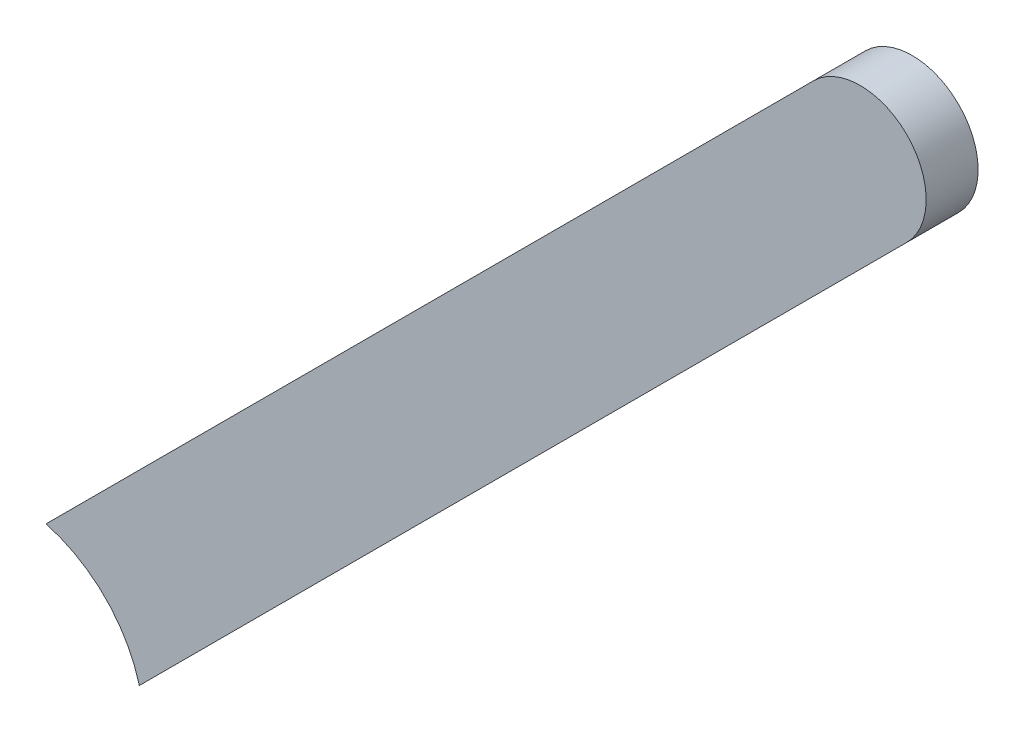
ISO-10303-21;
HEADER;
FILE_DESCRIPTION(('STEP AP214'),'2;1');
FILE_NAME('part.step','',(''),(''),'','','');
FILE_SCHEMA(('AUTOMOTIVE_DESIGN { 1 0 10303 214 1 1 1 1 }'));
ENDSEC;
DATA;
#1=APPLICATION_CONTEXT('core data for automotive mechanical design processes');
#2=APPLICATION_PROTOCOL_DEFINITION('international standard','automotive_design',2000,#1);
#3=PRODUCT_CONTEXT('',#1,'mechanical');
#4=PRODUCT('Part','Part','',(#3));
#5=PRODUCT_RELATED_PRODUCT_CATEGORY('part','',(#4));
#6=PRODUCT_DEFINITION_FORMATION('','',#4);
#7=PRODUCT_DEFINITION_CONTEXT('part definition',#1,'design');
#8=PRODUCT_DEFINITION('design','',#6,#7);
#9=PRODUCT_DEFINITION_SHAPE('','',#8);
#10=(LENGTH_UNIT() NAMED_UNIT(*) SI_UNIT(.MILLI.,.METRE.));
#11=(NAMED_UNIT(*) PLANE_ANGLE_UNIT() SI_UNIT($,.RADIAN.));
#12=(NAMED_UNIT(*) SI_UNIT($,.STERADIAN.) SOLID_ANGLE_UNIT());
#13=UNCERTAINTY_MEASURE_WITH_UNIT(LENGTH_MEASURE(1.E-05),#10,'distance_accuracy_value','');
#14=(GEOMETRIC_REPRESENTATION_CONTEXT(3) GLOBAL_UNCERTAINTY_ASSIGNED_CONTEXT((#13)) GLOBAL_UNIT_ASSIGNED_CONTEXT((#10,
#11,#12)) REPRESENTATION_CONTEXT('',''));
#15=CARTESIAN_POINT('',(0.,0.,0.));
#16=DIRECTION('',(0.,0.,1.));
#17=DIRECTION('',(1.,0.,0.));
#18=AXIS2_PLACEMENT_3D('',#15,#16,#17);
#19=CARTESIAN_POINT('',(141.206690128539,55.2860059885386,0.));
#20=DIRECTION('',(-0.707106781186547,0.707106781186548,0.));
#21=DIRECTION('',(0.707106781186548,0.707106781186547,0.));
#22=AXIS2_PLACEMENT_3D('',#19,#20,#21);
#23=PLANE('',#22);
#24=DIRECTION('',(0.707106781186548,0.707106781186547,0.));
#25=VECTOR('',#24,1.);
#26=CARTESIAN_POINT('',(140.8956034,54.97491926,0.1999996));
#27=LINE('',#26,#25);
#28=CARTESIAN_POINT('',(141.206690128539,55.2860059885386,0.1999996));
#29=VERTEX_POINT('',#28);
#30=CARTESIAN_POINT('',(144.16108074,58.2403966,0.1999996));
#31=VERTEX_POINT('',#30);
#32=EDGE_CURVE('E11',#29,#31,#27,.T.);
#33=ORIENTED_EDGE('',*,*,#32,.F.);
#34=DIRECTION('',(0.,0.,1.));
#35=VECTOR('',#34,1.);
#36=CARTESIAN_POINT('',(141.206690128539,55.2860059885386,0.));
#37=LINE('',#36,#35);
#38=CARTESIAN_POINT('',(141.206690128539,55.2860059885386,0.));
#39=VERTEX_POINT('',#38);
#40=EDGE_CURVE('E24',#39,#29,#37,.T.);
#41=ORIENTED_EDGE('',*,*,#40,.F.);
#42=DIRECTION('',(0.707106781186548,0.707106781186547,0.));
#43=VECTOR('',#42,1.);
#44=CARTESIAN_POINT('',(140.8956034,54.97491926,0.));
#45=LINE('',#44,#43);
#46=CARTESIAN_POINT('',(144.16108074,58.2403966,0.));
#47=VERTEX_POINT('',#46);
#48=EDGE_CURVE('E75',#39,#47,#45,.T.);
#49=ORIENTED_EDGE('',*,*,#48,.T.);
#50=DIRECTION('',(0.,0.,1.));
#51=VECTOR('',#50,1.);
#52=CARTESIAN_POINT('',(144.16108074,58.2403966,0.));
#53=LINE('',#52,#51);
#54=EDGE_CURVE('E37',#47,#31,#53,.T.);
#55=ORIENTED_EDGE('',*,*,#54,.T.);
#56=EDGE_LOOP('',(#33,#41,#49,#55));
#57=FACE_BOUND('',#56,.T.);
#58=ADVANCED_FACE('F17',(#57),#23,.F.);
#59=CARTESIAN_POINT('',(143.98147607,58.42000127,0.));
#60=DIRECTION('',(0.,0.,-1.));
#61=DIRECTION('',(0.707106781186618,-0.707106781186478,0.));
#62=AXIS2_PLACEMENT_3D('',#59,#60,#61);
#63=CYLINDRICAL_SURFACE('',#62,0.253999360179561);
#64=CARTESIAN_POINT('',(143.98147607,58.42000127,0.1999996));
#65=DIRECTION('',(0.,0.,1.));
#66=DIRECTION('',(0.707106781186618,-0.707106781186478,0.));
#67=AXIS2_PLACEMENT_3D('',#64,#65,#66);
#68=CIRCLE('',#67,0.253999360179561);
#69=CARTESIAN_POINT('',(143.8018714,58.59960594,0.1999996));
#70=VERTEX_POINT('',#69);
#71=EDGE_CURVE('E83',#31,#70,#68,.T.);
#72=ORIENTED_EDGE('',*,*,#71,.F.);
#73=ORIENTED_EDGE('',*,*,#54,.F.);
#74=CARTESIAN_POINT('',(143.98147607,58.42000127,0.));
#75=DIRECTION('',(0.,0.,1.));
#76=DIRECTION('',(0.707106781186618,-0.707106781186478,0.));
#77=AXIS2_PLACEMENT_3D('',#74,#75,#76);
#78=CIRCLE('',#77,0.253999360179561);
#79=CARTESIAN_POINT('',(143.8018714,58.59960594,0.));
#80=VERTEX_POINT('',#79);
#81=EDGE_CURVE('E81',#47,#80,#78,.T.);
#82=ORIENTED_EDGE('',*,*,#81,.T.);
#83=DIRECTION('',(0.,0.,1.));
#84=VECTOR('',#83,1.);
#85=CARTESIAN_POINT('',(143.8018714,58.59960594,0.));
#86=LINE('',#85,#84);
#87=EDGE_CURVE('E67',#80,#70,#86,.T.);
#88=ORIENTED_EDGE('',*,*,#87,.T.);
#89=EDGE_LOOP('',(#72,#73,#82,#88));
#90=FACE_BOUND('',#89,.T.);
#91=ADVANCED_FACE('F89',(#90),#63,.T.);
#92=CARTESIAN_POINT('',(143.8018714,58.59960594,0.));
#93=DIRECTION('',(0.707106781186549,-0.707106781186546,0.));
#94=DIRECTION('',(-0.707106781186546,-0.707106781186549,0.));
#95=AXIS2_PLACEMENT_3D('',#92,#93,#94);
#96=PLANE('',#95);
#97=DIRECTION('',(-0.707106781186546,-0.707106781186549,0.));
#98=VECTOR('',#97,1.);
#99=CARTESIAN_POINT('',(143.8018714,58.59960594,0.1999996));
#100=LINE('',#99,#98);
#101=CARTESIAN_POINT('',(140.847480788539,55.6452153285386,0.1999996));
#102=VERTEX_POINT('',#101);
#103=EDGE_CURVE('E71',#70,#102,#100,.T.);
#104=ORIENTED_EDGE('',*,*,#103,.F.);
#105=ORIENTED_EDGE('',*,*,#87,.F.);
#106=DIRECTION('',(-0.707106781186546,-0.707106781186549,0.));
#107=VECTOR('',#106,1.);
#108=CARTESIAN_POINT('',(143.8018714,58.59960594,0.));
#109=LINE('',#108,#107);
#110=CARTESIAN_POINT('',(140.847480788539,55.6452153285386,0.));
#111=VERTEX_POINT('',#110);
#112=EDGE_CURVE('E63',#80,#111,#109,.T.);
#113=ORIENTED_EDGE('',*,*,#112,.T.);
#114=DIRECTION('',(0.,0.,1.));
#115=VECTOR('',#114,1.);
#116=CARTESIAN_POINT('',(140.847480788539,55.6452153285386,0.));
#117=LINE('',#116,#115);
#118=EDGE_CURVE('E53',#111,#102,#117,.T.);
#119=ORIENTED_EDGE('',*,*,#118,.T.);
#120=EDGE_LOOP('',(#104,#105,#113,#119));
#121=FACE_BOUND('',#120,.T.);
#122=ADVANCED_FACE('F66',(#121),#96,.F.);
#123=CARTESIAN_POINT('',(140.716,55.1545252,0.));
#124=DIRECTION('',(0.,0.,-1.));
#125=DIRECTION('',(1.,0.,0.));
#126=AXIS2_PLACEMENT_3D('',#123,#124,#125);
#127=CYLINDRICAL_SURFACE('',#126,0.508);
#128=ORIENTED_EDGE('',*,*,#40,.T.);
#129=CARTESIAN_POINT('',(140.716,55.1545252,0.1999996));
#130=DIRECTION('',(0.,0.,1.));
#131=DIRECTION('',(1.,0.,0.));
#132=AXIS2_PLACEMENT_3D('',#129,#130,#131);
#133=CIRCLE('',#132,0.508);
#134=EDGE_CURVE('E59',#29,#102,#133,.T.);
#135=ORIENTED_EDGE('',*,*,#134,.T.);
#136=ORIENTED_EDGE('',*,*,#118,.F.);
#137=CARTESIAN_POINT('',(140.716,55.1545252,0.));
#138=DIRECTION('',(0.,0.,1.));
#139=DIRECTION('',(1.,0.,0.));
#140=AXIS2_PLACEMENT_3D('',#137,#138,#139);
#141=CIRCLE('',#140,0.508);
#142=EDGE_CURVE('E57',#39,#111,#141,.T.);
#143=ORIENTED_EDGE('',*,*,#142,.F.);
#144=EDGE_LOOP('',(#128,#135,#136,#143));
#145=FACE_BOUND('',#144,.T.);
#146=ADVANCED_FACE('F55',(#145),#127,.F.);
#147=CARTESIAN_POINT('',(140.8956034,54.97491926,0.));
#148=DIRECTION('',(0.,0.,-1.));
#149=DIRECTION('',(-1.,0.,0.));
#150=AXIS2_PLACEMENT_3D('',#147,#148,#149);
#151=PLANE('',#150);
#152=ORIENTED_EDGE('',*,*,#48,.F.);
#153=ORIENTED_EDGE('',*,*,#142,.T.);
#154=ORIENTED_EDGE('',*,*,#112,.F.);
#155=ORIENTED_EDGE('',*,*,#81,.F.);
#156=EDGE_LOOP('',(#152,#153,#154,#155));
#157=FACE_BOUND('',#156,.T.);
#158=ADVANCED_FACE('F74',(#157),#151,.T.);
#159=CARTESIAN_POINT('',(140.8956034,54.97491926,0.1999996));
#160=DIRECTION('',(0.,0.,-1.));
#161=DIRECTION('',(-1.,0.,0.));
#162=AXIS2_PLACEMENT_3D('',#159,#160,#161);
#163=PLANE('',#162);
#164=ORIENTED_EDGE('',*,*,#134,.F.);
#165=ORIENTED_EDGE('',*,*,#32,.T.);
#166=ORIENTED_EDGE('',*,*,#71,.T.);
#167=ORIENTED_EDGE('',*,*,#103,.T.);
#168=EDGE_LOOP('',(#164,#165,#166,#167));
#169=FACE_BOUND('',#168,.T.);
#170=ADVANCED_FACE('F91',(#169),#163,.F.);
#171=CLOSED_SHELL('',(#58,#91,#122,#146,#158,#170));
#172=MANIFOLD_SOLID_BREP('B1',#171);
#173=ADVANCED_BREP_SHAPE_REPRESENTATION('',(#18,#172),#14);
#174=SHAPE_DEFINITION_REPRESENTATION(#9,#173);
ENDSEC;
END-ISO-10303-21;
